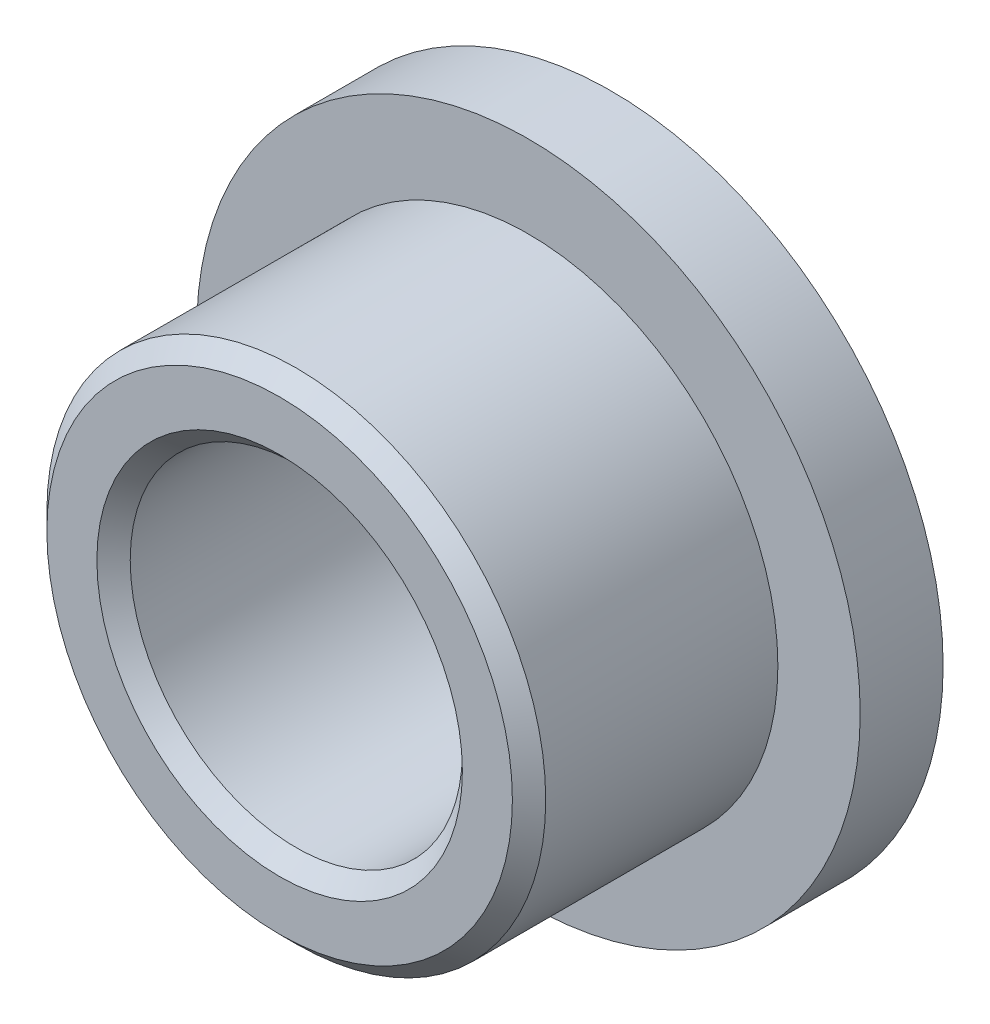
ISO-10303-21;
HEADER;
FILE_DESCRIPTION(('STEP AP214'),'2;1');
FILE_NAME('part.step','',(''),(''),'','','');
FILE_SCHEMA(('AUTOMOTIVE_DESIGN { 1 0 10303 214 1 1 1 1 }'));
ENDSEC;
DATA;
#1=APPLICATION_CONTEXT('core data for automotive mechanical design processes');
#2=APPLICATION_PROTOCOL_DEFINITION('international standard','automotive_design',2000,#1);
#3=PRODUCT_CONTEXT('',#1,'mechanical');
#4=PRODUCT('Part','Part','',(#3));
#5=PRODUCT_RELATED_PRODUCT_CATEGORY('part','',(#4));
#6=PRODUCT_DEFINITION_FORMATION('','',#4);
#7=PRODUCT_DEFINITION_CONTEXT('part definition',#1,'design');
#8=PRODUCT_DEFINITION('design','',#6,#7);
#9=PRODUCT_DEFINITION_SHAPE('','',#8);
#10=(LENGTH_UNIT() NAMED_UNIT(*) SI_UNIT(.MILLI.,.METRE.));
#11=(NAMED_UNIT(*) PLANE_ANGLE_UNIT() SI_UNIT($,.RADIAN.));
#12=(NAMED_UNIT(*) SI_UNIT($,.STERADIAN.) SOLID_ANGLE_UNIT());
#13=UNCERTAINTY_MEASURE_WITH_UNIT(LENGTH_MEASURE(1.E-05),#10,'distance_accuracy_value','');
#14=(GEOMETRIC_REPRESENTATION_CONTEXT(3) GLOBAL_UNCERTAINTY_ASSIGNED_CONTEXT((#13)) GLOBAL_UNIT_ASSIGNED_CONTEXT((#10,
#11,#12)) REPRESENTATION_CONTEXT('',''));
#15=CARTESIAN_POINT('',(0.,0.,0.));
#16=DIRECTION('',(0.,0.,1.));
#17=DIRECTION('',(1.,0.,0.));
#18=AXIS2_PLACEMENT_3D('',#15,#16,#17);
#19=CARTESIAN_POINT('',(0.,4.005,-4.));
#20=DIRECTION('',(0.,0.,1.));
#21=DIRECTION('',(1.,0.,0.));
#22=AXIS2_PLACEMENT_3D('',#19,#20,#21);
#23=PLANE('',#22);
#24=CARTESIAN_POINT('',(0.,0.,-4.));
#25=DIRECTION('',(0.,0.,1.));
#26=DIRECTION('',(1.,0.,0.));
#27=AXIS2_PLACEMENT_3D('',#24,#25,#26);
#28=CIRCLE('',#27,4.407);
#29=CARTESIAN_POINT('',(4.407,0.,-4.));
#30=VERTEX_POINT('',#29);
#31=EDGE_CURVE('E53',#30,#30,#28,.T.);
#32=ORIENTED_EDGE('',*,*,#31,.T.);
#33=EDGE_LOOP('',(#32));
#34=FACE_BOUND('',#33,.T.);
#35=CARTESIAN_POINT('',(0.,0.,-4.));
#36=DIRECTION('',(0.,0.,1.));
#37=DIRECTION('',(1.,0.,0.));
#38=AXIS2_PLACEMENT_3D('',#35,#36,#37);
#39=CIRCLE('',#38,8.);
#40=CARTESIAN_POINT('',(8.,0.,-4.));
#41=VERTEX_POINT('',#40);
#42=EDGE_CURVE('E77',#41,#41,#39,.T.);
#43=ORIENTED_EDGE('',*,*,#42,.F.);
#44=EDGE_LOOP('',(#43));
#45=FACE_BOUND('',#44,.T.);
#46=ADVANCED_FACE('F45',(#34,#45),#23,.F.);
#47=CARTESIAN_POINT('',(0.,0.,4.));
#48=DIRECTION('',(0.,0.,1.));
#49=DIRECTION('',(1.,0.,0.));
#50=AXIS2_PLACEMENT_3D('',#47,#48,#49);
#51=CYLINDRICAL_SURFACE('',#50,8.);
#52=CARTESIAN_POINT('',(0.,0.,-2.));
#53=DIRECTION('',(0.,0.,1.));
#54=DIRECTION('',(1.,0.,0.));
#55=AXIS2_PLACEMENT_3D('',#52,#53,#54);
#56=CIRCLE('',#55,8.);
#57=CARTESIAN_POINT('',(8.,0.,-2.));
#58=VERTEX_POINT('',#57);
#59=EDGE_CURVE('E81',#58,#58,#56,.T.);
#60=ORIENTED_EDGE('',*,*,#59,.F.);
#61=EDGE_LOOP('',(#60));
#62=FACE_BOUND('',#61,.T.);
#63=ORIENTED_EDGE('',*,*,#42,.T.);
#64=EDGE_LOOP('',(#63));
#65=FACE_BOUND('',#64,.T.);
#66=ADVANCED_FACE('F95',(#62,#65),#51,.T.);
#67=CARTESIAN_POINT('',(0.,8.,-2.));
#68=DIRECTION('',(0.,0.,-1.));
#69=DIRECTION('',(-1.,0.,0.));
#70=AXIS2_PLACEMENT_3D('',#67,#68,#69);
#71=PLANE('',#70);
#72=CARTESIAN_POINT('',(0.,0.,-2.));
#73=DIRECTION('',(0.,0.,1.));
#74=DIRECTION('',(1.,0.,0.));
#75=AXIS2_PLACEMENT_3D('',#72,#73,#74);
#76=CIRCLE('',#75,6.015);
#77=CARTESIAN_POINT('',(6.015,0.,-2.));
#78=VERTEX_POINT('',#77);
#79=EDGE_CURVE('E85',#78,#78,#76,.T.);
#80=ORIENTED_EDGE('',*,*,#79,.F.);
#81=EDGE_LOOP('',(#80));
#82=FACE_BOUND('',#81,.T.);
#83=ORIENTED_EDGE('',*,*,#59,.T.);
#84=EDGE_LOOP('',(#83));
#85=FACE_BOUND('',#84,.T.);
#86=ADVANCED_FACE('F92',(#82,#85),#71,.F.);
#87=CARTESIAN_POINT('',(0.,0.,4.));
#88=DIRECTION('',(0.,0.,1.));
#89=DIRECTION('',(1.,0.,0.));
#90=AXIS2_PLACEMENT_3D('',#87,#88,#89);
#91=CYLINDRICAL_SURFACE('',#90,6.015);
#92=CARTESIAN_POINT('',(0.,0.,3.598));
#93=DIRECTION('',(0.,0.,-1.));
#94=DIRECTION('',(-1.,0.,0.));
#95=AXIS2_PLACEMENT_3D('',#92,#93,#94);
#96=CIRCLE('',#95,6.015);
#97=CARTESIAN_POINT('',(-6.015,0.,3.598));
#98=VERTEX_POINT('',#97);
#99=EDGE_CURVE('E10',#98,#98,#96,.T.);
#100=ORIENTED_EDGE('',*,*,#99,.T.);
#101=EDGE_LOOP('',(#100));
#102=FACE_BOUND('',#101,.T.);
#103=ORIENTED_EDGE('',*,*,#79,.T.);
#104=EDGE_LOOP('',(#103));
#105=FACE_BOUND('',#104,.T.);
#106=ADVANCED_FACE('F90',(#102,#105),#91,.T.);
#107=CARTESIAN_POINT('',(0.,6.015,4.));
#108=DIRECTION('',(0.,0.,-1.));
#109=DIRECTION('',(-1.,0.,0.));
#110=AXIS2_PLACEMENT_3D('',#107,#108,#109);
#111=PLANE('',#110);
#112=CARTESIAN_POINT('',(0.,0.,4.));
#113=DIRECTION('',(0.,0.,-1.));
#114=DIRECTION('',(-1.,0.,0.));
#115=AXIS2_PLACEMENT_3D('',#112,#113,#114);
#116=CIRCLE('',#115,4.407);
#117=CARTESIAN_POINT('',(-4.407,0.,4.));
#118=VERTEX_POINT('',#117);
#119=EDGE_CURVE('E58',#118,#118,#116,.T.);
#120=ORIENTED_EDGE('',*,*,#119,.T.);
#121=EDGE_LOOP('',(#120));
#122=FACE_BOUND('',#121,.T.);
#123=CARTESIAN_POINT('',(0.,0.,4.));
#124=DIRECTION('',(0.,0.,-1.));
#125=DIRECTION('',(-1.,0.,0.));
#126=AXIS2_PLACEMENT_3D('',#123,#124,#125);
#127=CIRCLE('',#126,5.613);
#128=CARTESIAN_POINT('',(-5.613,0.,4.));
#129=VERTEX_POINT('',#128);
#130=EDGE_CURVE('E63',#129,#129,#127,.F.);
#131=ORIENTED_EDGE('',*,*,#130,.T.);
#132=EDGE_LOOP('',(#131));
#133=FACE_BOUND('',#132,.T.);
#134=ADVANCED_FACE('F124',(#122,#133),#111,.F.);
#135=CARTESIAN_POINT('',(0.,0.,4.));
#136=DIRECTION('',(0.,0.,1.));
#137=DIRECTION('',(1.,0.,0.));
#138=AXIS2_PLACEMENT_3D('',#135,#136,#137);
#139=CYLINDRICAL_SURFACE('',#138,4.005);
#140=CARTESIAN_POINT('',(0.,0.,3.598));
#141=DIRECTION('',(0.,0.,-1.));
#142=DIRECTION('',(-1.,0.,0.));
#143=AXIS2_PLACEMENT_3D('',#140,#141,#142);
#144=CIRCLE('',#143,4.005);
#145=CARTESIAN_POINT('',(-4.005,0.,3.598));
#146=VERTEX_POINT('',#145);
#147=EDGE_CURVE('E69',#146,#146,#144,.F.);
#148=ORIENTED_EDGE('',*,*,#147,.T.);
#149=EDGE_LOOP('',(#148));
#150=FACE_BOUND('',#149,.T.);
#151=CARTESIAN_POINT('',(0.,0.,-3.598));
#152=DIRECTION('',(0.,0.,1.));
#153=DIRECTION('',(1.,0.,0.));
#154=AXIS2_PLACEMENT_3D('',#151,#152,#153);
#155=CIRCLE('',#154,4.005);
#156=CARTESIAN_POINT('',(4.005,0.,-3.598));
#157=VERTEX_POINT('',#156);
#158=EDGE_CURVE('E73',#157,#157,#155,.F.);
#159=ORIENTED_EDGE('',*,*,#158,.T.);
#160=EDGE_LOOP('',(#159));
#161=FACE_BOUND('',#160,.T.);
#162=ADVANCED_FACE('F112',(#150,#161),#139,.F.);
#163=CARTESIAN_POINT('',(0.,0.,3.598));
#164=DIRECTION('',(0.,0.,1.));
#165=DIRECTION('',(1.,0.,0.));
#166=AXIS2_PLACEMENT_3D('',#163,#164,#165);
#167=CONICAL_SURFACE('',#166,4.005,0.785398163397454);
#168=ORIENTED_EDGE('',*,*,#119,.F.);
#169=EDGE_LOOP('',(#168));
#170=FACE_BOUND('',#169,.T.);
#171=ORIENTED_EDGE('',*,*,#147,.F.);
#172=EDGE_LOOP('',(#171));
#173=FACE_BOUND('',#172,.T.);
#174=ADVANCED_FACE('F109',(#170,#173),#167,.F.);
#175=CARTESIAN_POINT('',(0.,0.,-4.));
#176=DIRECTION('',(0.,0.,-1.));
#177=DIRECTION('',(-1.,0.,0.));
#178=AXIS2_PLACEMENT_3D('',#175,#176,#177);
#179=CONICAL_SURFACE('',#178,4.407,0.785398163397447);
#180=ORIENTED_EDGE('',*,*,#158,.F.);
#181=EDGE_LOOP('',(#180));
#182=FACE_BOUND('',#181,.T.);
#183=ORIENTED_EDGE('',*,*,#31,.F.);
#184=EDGE_LOOP('',(#183));
#185=FACE_BOUND('',#184,.T.);
#186=ADVANCED_FACE('F111',(#182,#185),#179,.F.);
#187=CARTESIAN_POINT('',(0.,0.,4.));
#188=DIRECTION('',(0.,0.,-1.));
#189=DIRECTION('',(-1.,0.,0.));
#190=AXIS2_PLACEMENT_3D('',#187,#188,#189);
#191=CONICAL_SURFACE('',#190,5.613,0.785398163397445);
#192=CARTESIAN_POINT('',(-6.015,0.,3.598));
#193=CARTESIAN_POINT('',(-6.0108125,0.,3.6021875));
#194=CARTESIAN_POINT('',(-6.006625,0.,3.606375));
#195=CARTESIAN_POINT('',(-5.99825,0.,3.61475));
#196=CARTESIAN_POINT('',(-5.9940625,0.,3.6189375));
#197=CARTESIAN_POINT('',(-5.9856875,0.,3.6273125));
#198=CARTESIAN_POINT('',(-5.9815,0.,3.6315));
#199=CARTESIAN_POINT('',(-5.973125,0.,3.639875));
#200=CARTESIAN_POINT('',(-5.9689375,0.,3.6440625));
#201=CARTESIAN_POINT('',(-5.9605625,0.,3.6524375));
#202=CARTESIAN_POINT('',(-5.956375,0.,3.656625));
#203=CARTESIAN_POINT('',(-5.948,0.,3.665));
#204=CARTESIAN_POINT('',(-5.9438125,0.,3.6691875));
#205=CARTESIAN_POINT('',(-5.9354375,0.,3.6775625));
#206=CARTESIAN_POINT('',(-5.93125,0.,3.68175));
#207=CARTESIAN_POINT('',(-5.922875,0.,3.690125));
#208=CARTESIAN_POINT('',(-5.9186875,0.,3.6943125));
#209=CARTESIAN_POINT('',(-5.9103125,0.,3.7026875));
#210=CARTESIAN_POINT('',(-5.906125,0.,3.706875));
#211=CARTESIAN_POINT('',(-5.89775,0.,3.71525));
#212=CARTESIAN_POINT('',(-5.8935625,0.,3.7194375));
#213=CARTESIAN_POINT('',(-5.8851875,0.,3.7278125));
#214=CARTESIAN_POINT('',(-5.881,0.,3.732));
#215=CARTESIAN_POINT('',(-5.872625,0.,3.740375));
#216=CARTESIAN_POINT('',(-5.8684375,0.,3.7445625));
#217=CARTESIAN_POINT('',(-5.8600625,0.,3.7529375));
#218=CARTESIAN_POINT('',(-5.855875,0.,3.757125));
#219=CARTESIAN_POINT('',(-5.8475,0.,3.7655));
#220=CARTESIAN_POINT('',(-5.8433125,0.,3.7696875));
#221=CARTESIAN_POINT('',(-5.8349375,0.,3.7780625));
#222=CARTESIAN_POINT('',(-5.83075,0.,3.78225));
#223=CARTESIAN_POINT('',(-5.822375,0.,3.790625));
#224=CARTESIAN_POINT('',(-5.8181875,0.,3.7948125));
#225=CARTESIAN_POINT('',(-5.8098125,0.,3.8031875));
#226=CARTESIAN_POINT('',(-5.805625,0.,3.807375));
#227=CARTESIAN_POINT('',(-5.79725,0.,3.81575));
#228=CARTESIAN_POINT('',(-5.7930625,0.,3.8199375));
#229=CARTESIAN_POINT('',(-5.7846875,0.,3.8283125));
#230=CARTESIAN_POINT('',(-5.7805,0.,3.8325));
#231=CARTESIAN_POINT('',(-5.772125,0.,3.840875));
#232=CARTESIAN_POINT('',(-5.7679375,0.,3.8450625));
#233=CARTESIAN_POINT('',(-5.7595625,0.,3.8534375));
#234=CARTESIAN_POINT('',(-5.755375,0.,3.857625));
#235=CARTESIAN_POINT('',(-5.747,0.,3.866));
#236=CARTESIAN_POINT('',(-5.7428125,0.,3.8701875));
#237=CARTESIAN_POINT('',(-5.7344375,0.,3.8785625));
#238=CARTESIAN_POINT('',(-5.73025,0.,3.88275));
#239=CARTESIAN_POINT('',(-5.721875,0.,3.891125));
#240=CARTESIAN_POINT('',(-5.7176875,0.,3.8953125));
#241=CARTESIAN_POINT('',(-5.7093125,0.,3.9036875));
#242=CARTESIAN_POINT('',(-5.705125,0.,3.907875));
#243=CARTESIAN_POINT('',(-5.69675,0.,3.91625));
#244=CARTESIAN_POINT('',(-5.6925625,0.,3.9204375));
#245=CARTESIAN_POINT('',(-5.6841875,0.,3.9288125));
#246=CARTESIAN_POINT('',(-5.68,0.,3.933));
#247=CARTESIAN_POINT('',(-5.671625,0.,3.941375));
#248=CARTESIAN_POINT('',(-5.6674375,0.,3.9455625));
#249=CARTESIAN_POINT('',(-5.6590625,0.,3.9539375));
#250=CARTESIAN_POINT('',(-5.654875,0.,3.958125));
#251=CARTESIAN_POINT('',(-5.6465,0.,3.9665));
#252=CARTESIAN_POINT('',(-5.6423125,0.,3.9706875));
#253=CARTESIAN_POINT('',(-5.6339375,0.,3.9790625));
#254=CARTESIAN_POINT('',(-5.62975,0.,3.98325));
#255=CARTESIAN_POINT('',(-5.621375,0.,3.991625));
#256=CARTESIAN_POINT('',(-5.6171875,0.,3.9958125));
#257=CARTESIAN_POINT('',(-5.613,0.,4.));
#258=B_SPLINE_CURVE_WITH_KNOTS('',3,(#192,#193,#194,#195,#196,#197,#198,#199,#200,#201,#202,
#203,#204,#205,#206,#207,#208,#209,#210,#211,#212,#213,#214,#215,#216,#217,#218,#219,#220,#221,
#222,#223,#224,#225,#226,#227,#228,#229,#230,#231,#232,#233,#234,#235,#236,#237,#238,#239,#240,
#241,#242,#243,#244,#245,#246,#247,#248,#249,#250,#251,#252,#253,#254,#255,#256,#257),
.UNSPECIFIED.,.F.,.F.,(4,2,2,2,2,2,2,2,2,2,2,2,2,2,2,2,2,2,2,2,2,2,2,2,2,2,2,2,2,2,2,2,4),(0.,
0.0177660578773123,0.0355321157546237,0.0532981736319354,0.0710642315092476,0.0888302893865593,
0.106596347263871,0.124362405141183,0.142128463018495,0.159894520895807,0.177660578773119,
0.19542663665043,0.213192694527742,0.230958752405054,0.248724810282366,0.266490868159678,
0.28425692603699,0.302022983914302,0.319789041791614,0.337555099668926,0.355321157546237,
0.373087215423549,0.390853273300861,0.408619331178173,0.426385389055485,0.444151446932796,
0.461917504810108,0.47968356268742,0.497449620564732,0.515215678442044,0.532981736319356,
0.550747794196668,0.568513852073979),.UNSPECIFIED.);
#259=EDGE_CURVE('BSEAM47',#98,#129,#258,.T.);
#260=ORIENTED_EDGE('',*,*,#99,.F.);
#261=ORIENTED_EDGE('',*,*,#130,.F.);
#262=ORIENTED_EDGE('',*,*,#259,.T.);
#263=ORIENTED_EDGE('',*,*,#259,.F.);
#264=EDGE_LOOP('',(#260,#262,#261,#263));
#265=FACE_BOUND('',#264,.T.);
#266=ADVANCED_FACE('F47',(#265),#191,.T.);
#267=CLOSED_SHELL('',(#46,#66,#86,#106,#134,#162,#174,#186,#266));
#268=MANIFOLD_SOLID_BREP('B2',#267);
#269=ADVANCED_BREP_SHAPE_REPRESENTATION('',(#18,#268),#14);
#270=SHAPE_DEFINITION_REPRESENTATION(#9,#269);
ENDSEC;
END-ISO-10303-21;
